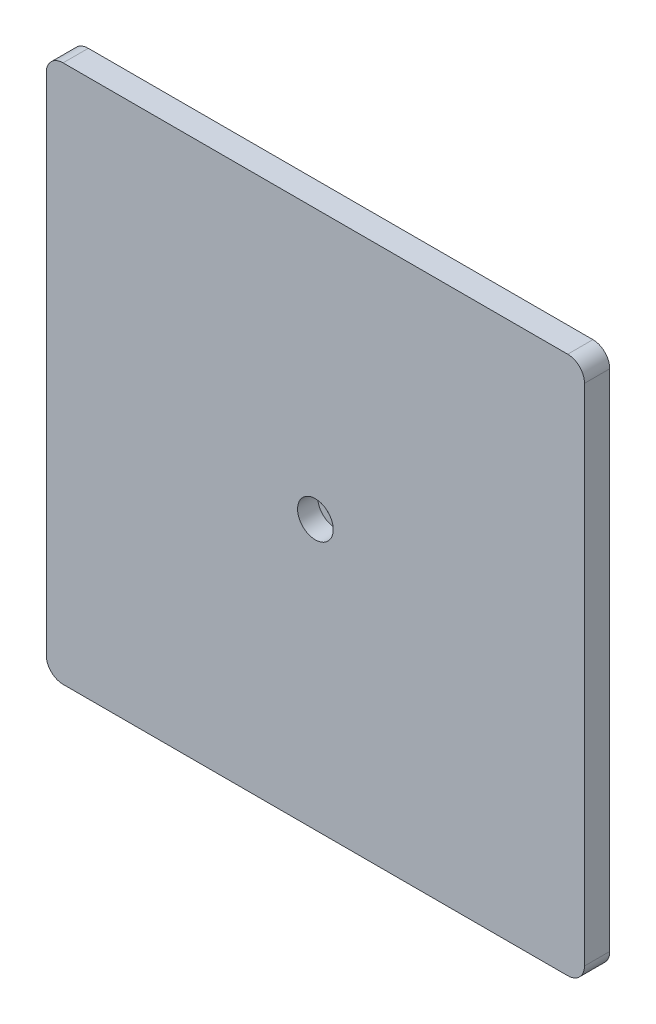
ISO-10303-21;
HEADER;
FILE_DESCRIPTION(('STEP AP214'),'2;1');
FILE_NAME('part.step','',(''),(''),'','','');
FILE_SCHEMA(('AUTOMOTIVE_DESIGN { 1 0 10303 214 1 1 1 1 }'));
ENDSEC;
DATA;
#1=APPLICATION_CONTEXT('core data for automotive mechanical design processes');
#2=APPLICATION_PROTOCOL_DEFINITION('international standard','automotive_design',2000,#1);
#3=PRODUCT_CONTEXT('',#1,'mechanical');
#4=PRODUCT('Part','Part','',(#3));
#5=PRODUCT_RELATED_PRODUCT_CATEGORY('part','',(#4));
#6=PRODUCT_DEFINITION_FORMATION('','',#4);
#7=PRODUCT_DEFINITION_CONTEXT('part definition',#1,'design');
#8=PRODUCT_DEFINITION('design','',#6,#7);
#9=PRODUCT_DEFINITION_SHAPE('','',#8);
#10=(LENGTH_UNIT() NAMED_UNIT(*) SI_UNIT(.MILLI.,.METRE.));
#11=(NAMED_UNIT(*) PLANE_ANGLE_UNIT() SI_UNIT($,.RADIAN.));
#12=(NAMED_UNIT(*) SI_UNIT($,.STERADIAN.) SOLID_ANGLE_UNIT());
#13=UNCERTAINTY_MEASURE_WITH_UNIT(LENGTH_MEASURE(1.E-05),#10,'distance_accuracy_value','');
#14=(GEOMETRIC_REPRESENTATION_CONTEXT(3) GLOBAL_UNCERTAINTY_ASSIGNED_CONTEXT((#13)) GLOBAL_UNIT_ASSIGNED_CONTEXT((#10,
#11,#12)) REPRESENTATION_CONTEXT('',''));
#15=CARTESIAN_POINT('',(0.,0.,0.));
#16=DIRECTION('',(0.,0.,1.));
#17=DIRECTION('',(1.,0.,0.));
#18=AXIS2_PLACEMENT_3D('',#15,#16,#17);
#19=CARTESIAN_POINT('',(-150.,-150.,15.));
#20=DIRECTION('',(0.,0.,-1.));
#21=DIRECTION('',(-1.,0.,0.));
#22=AXIS2_PLACEMENT_3D('',#19,#20,#21);
#23=CYLINDRICAL_SURFACE('',#22,10.);
#24=CARTESIAN_POINT('',(-150.,-150.,0.));
#25=DIRECTION('',(0.,0.,1.));
#26=DIRECTION('',(1.,0.,0.));
#27=AXIS2_PLACEMENT_3D('',#24,#25,#26);
#28=CIRCLE('',#27,10.);
#29=CARTESIAN_POINT('',(-160.,-150.,0.));
#30=VERTEX_POINT('',#29);
#31=CARTESIAN_POINT('',(-150.,-160.,0.));
#32=VERTEX_POINT('',#31);
#33=EDGE_CURVE('E140',#30,#32,#28,.T.);
#34=ORIENTED_EDGE('',*,*,#33,.T.);
#35=DIRECTION('',(0.,0.,-1.));
#36=VECTOR('',#35,1.);
#37=CARTESIAN_POINT('',(-150.,-160.,15.));
#38=LINE('',#37,#36);
#39=CARTESIAN_POINT('',(-150.,-160.,15.));
#40=VERTEX_POINT('',#39);
#41=EDGE_CURVE('E11',#40,#32,#38,.T.);
#42=ORIENTED_EDGE('',*,*,#41,.F.);
#43=CARTESIAN_POINT('',(-150.,-150.,15.));
#44=DIRECTION('',(0.,0.,1.));
#45=DIRECTION('',(1.,0.,0.));
#46=AXIS2_PLACEMENT_3D('',#43,#44,#45);
#47=CIRCLE('',#46,10.);
#48=CARTESIAN_POINT('',(-160.,-150.,15.));
#49=VERTEX_POINT('',#48);
#50=EDGE_CURVE('E163',#49,#40,#47,.T.);
#51=ORIENTED_EDGE('',*,*,#50,.F.);
#52=DIRECTION('',(0.,0.,-1.));
#53=VECTOR('',#52,1.);
#54=CARTESIAN_POINT('',(-160.,-150.,15.));
#55=LINE('',#54,#53);
#56=EDGE_CURVE('E136',#49,#30,#55,.T.);
#57=ORIENTED_EDGE('',*,*,#56,.T.);
#58=EDGE_LOOP('',(#34,#42,#51,#57));
#59=FACE_BOUND('',#58,.T.);
#60=ADVANCED_FACE('F38',(#59),#23,.T.);
#61=CARTESIAN_POINT('',(-150.,-160.,15.));
#62=DIRECTION('',(0.,1.,0.));
#63=DIRECTION('',(0.,0.,1.));
#64=AXIS2_PLACEMENT_3D('',#61,#62,#63);
#65=PLANE('',#64);
#66=DIRECTION('',(1.,0.,0.));
#67=VECTOR('',#66,1.);
#68=CARTESIAN_POINT('',(-150.,-160.,0.));
#69=LINE('',#68,#67);
#70=CARTESIAN_POINT('',(150.,-160.,0.));
#71=VERTEX_POINT('',#70);
#72=EDGE_CURVE('E144',#32,#71,#69,.T.);
#73=ORIENTED_EDGE('',*,*,#72,.T.);
#74=DIRECTION('',(0.,0.,-1.));
#75=VECTOR('',#74,1.);
#76=CARTESIAN_POINT('',(150.,-160.,15.));
#77=LINE('',#76,#75);
#78=CARTESIAN_POINT('',(150.,-160.,15.));
#79=VERTEX_POINT('',#78);
#80=EDGE_CURVE('E48',#79,#71,#77,.T.);
#81=ORIENTED_EDGE('',*,*,#80,.F.);
#82=DIRECTION('',(1.,0.,0.));
#83=VECTOR('',#82,1.);
#84=CARTESIAN_POINT('',(-150.,-160.,15.));
#85=LINE('',#84,#83);
#86=EDGE_CURVE('E99',#40,#79,#85,.T.);
#87=ORIENTED_EDGE('',*,*,#86,.F.);
#88=ORIENTED_EDGE('',*,*,#41,.T.);
#89=EDGE_LOOP('',(#73,#81,#87,#88));
#90=FACE_BOUND('',#89,.T.);
#91=ADVANCED_FACE('F236',(#90),#65,.F.);
#92=CARTESIAN_POINT('',(150.,-150.,15.));
#93=DIRECTION('',(0.,0.,-1.));
#94=DIRECTION('',(-1.,0.,0.));
#95=AXIS2_PLACEMENT_3D('',#92,#93,#94);
#96=CYLINDRICAL_SURFACE('',#95,10.);
#97=CARTESIAN_POINT('',(150.,-150.,0.));
#98=DIRECTION('',(0.,0.,1.));
#99=DIRECTION('',(1.,0.,0.));
#100=AXIS2_PLACEMENT_3D('',#97,#98,#99);
#101=CIRCLE('',#100,10.);
#102=CARTESIAN_POINT('',(160.,-150.,0.));
#103=VERTEX_POINT('',#102);
#104=EDGE_CURVE('E148',#71,#103,#101,.T.);
#105=ORIENTED_EDGE('',*,*,#104,.T.);
#106=DIRECTION('',(0.,0.,-1.));
#107=VECTOR('',#106,1.);
#108=CARTESIAN_POINT('',(160.,-150.,15.));
#109=LINE('',#108,#107);
#110=CARTESIAN_POINT('',(160.,-150.,15.));
#111=VERTEX_POINT('',#110);
#112=EDGE_CURVE('E174',#111,#103,#109,.T.);
#113=ORIENTED_EDGE('',*,*,#112,.F.);
#114=CARTESIAN_POINT('',(150.,-150.,15.));
#115=DIRECTION('',(0.,0.,1.));
#116=DIRECTION('',(1.,0.,0.));
#117=AXIS2_PLACEMENT_3D('',#114,#115,#116);
#118=CIRCLE('',#117,10.);
#119=EDGE_CURVE('E185',#79,#111,#118,.T.);
#120=ORIENTED_EDGE('',*,*,#119,.F.);
#121=ORIENTED_EDGE('',*,*,#80,.T.);
#122=EDGE_LOOP('',(#105,#113,#120,#121));
#123=FACE_BOUND('',#122,.T.);
#124=ADVANCED_FACE('F183',(#123),#96,.T.);
#125=CARTESIAN_POINT('',(160.,150.,15.));
#126=DIRECTION('',(-1.,0.,0.));
#127=DIRECTION('',(0.,-1.,0.));
#128=AXIS2_PLACEMENT_3D('',#125,#126,#127);
#129=PLANE('',#128);
#130=DIRECTION('',(0.,1.,0.));
#131=VECTOR('',#130,1.);
#132=CARTESIAN_POINT('',(160.,150.,0.));
#133=LINE('',#132,#131);
#134=CARTESIAN_POINT('',(160.,150.,0.));
#135=VERTEX_POINT('',#134);
#136=EDGE_CURVE('E151',#103,#135,#133,.T.);
#137=ORIENTED_EDGE('',*,*,#136,.T.);
#138=DIRECTION('',(0.,0.,-1.));
#139=VECTOR('',#138,1.);
#140=CARTESIAN_POINT('',(160.,150.,15.));
#141=LINE('',#140,#139);
#142=CARTESIAN_POINT('',(160.,150.,15.));
#143=VERTEX_POINT('',#142);
#144=EDGE_CURVE('E170',#143,#135,#141,.T.);
#145=ORIENTED_EDGE('',*,*,#144,.F.);
#146=DIRECTION('',(0.,1.,0.));
#147=VECTOR('',#146,1.);
#148=CARTESIAN_POINT('',(160.,150.,15.));
#149=LINE('',#148,#147);
#150=EDGE_CURVE('E198',#111,#143,#149,.T.);
#151=ORIENTED_EDGE('',*,*,#150,.F.);
#152=ORIENTED_EDGE('',*,*,#112,.T.);
#153=EDGE_LOOP('',(#137,#145,#151,#152));
#154=FACE_BOUND('',#153,.T.);
#155=ADVANCED_FACE('F193',(#154),#129,.F.);
#156=CARTESIAN_POINT('',(150.,150.,15.));
#157=DIRECTION('',(0.,0.,-1.));
#158=DIRECTION('',(-1.,0.,0.));
#159=AXIS2_PLACEMENT_3D('',#156,#157,#158);
#160=CYLINDRICAL_SURFACE('',#159,10.);
#161=CARTESIAN_POINT('',(150.,150.,0.));
#162=DIRECTION('',(0.,0.,1.));
#163=DIRECTION('',(-1.,0.,0.));
#164=AXIS2_PLACEMENT_3D('',#161,#162,#163);
#165=CIRCLE('',#164,10.);
#166=CARTESIAN_POINT('',(150.,160.,0.));
#167=VERTEX_POINT('',#166);
#168=EDGE_CURVE('E154',#135,#167,#165,.T.);
#169=ORIENTED_EDGE('',*,*,#168,.T.);
#170=DIRECTION('',(0.,0.,-1.));
#171=VECTOR('',#170,1.);
#172=CARTESIAN_POINT('',(150.,160.,15.));
#173=LINE('',#172,#171);
#174=CARTESIAN_POINT('',(150.,160.,15.));
#175=VERTEX_POINT('',#174);
#176=EDGE_CURVE('E129',#175,#167,#173,.T.);
#177=ORIENTED_EDGE('',*,*,#176,.F.);
#178=CARTESIAN_POINT('',(150.,150.,15.));
#179=DIRECTION('',(0.,0.,1.));
#180=DIRECTION('',(-1.,0.,0.));
#181=AXIS2_PLACEMENT_3D('',#178,#179,#180);
#182=CIRCLE('',#181,10.);
#183=EDGE_CURVE('E118',#143,#175,#182,.T.);
#184=ORIENTED_EDGE('',*,*,#183,.F.);
#185=ORIENTED_EDGE('',*,*,#144,.T.);
#186=EDGE_LOOP('',(#169,#177,#184,#185));
#187=FACE_BOUND('',#186,.T.);
#188=ADVANCED_FACE('F196',(#187),#160,.T.);
#189=CARTESIAN_POINT('',(-150.,160.,15.));
#190=DIRECTION('',(0.,-1.,0.));
#191=DIRECTION('',(0.,0.,-1.));
#192=AXIS2_PLACEMENT_3D('',#189,#190,#191);
#193=PLANE('',#192);
#194=DIRECTION('',(-1.,0.,0.));
#195=VECTOR('',#194,1.);
#196=CARTESIAN_POINT('',(-150.,160.,0.));
#197=LINE('',#196,#195);
#198=CARTESIAN_POINT('',(-150.,160.,0.));
#199=VERTEX_POINT('',#198);
#200=EDGE_CURVE('E127',#167,#199,#197,.T.);
#201=ORIENTED_EDGE('',*,*,#200,.T.);
#202=DIRECTION('',(0.,0.,-1.));
#203=VECTOR('',#202,1.);
#204=CARTESIAN_POINT('',(-150.,160.,15.));
#205=LINE('',#204,#203);
#206=CARTESIAN_POINT('',(-150.,160.,15.));
#207=VERTEX_POINT('',#206);
#208=EDGE_CURVE('E124',#207,#199,#205,.T.);
#209=ORIENTED_EDGE('',*,*,#208,.F.);
#210=DIRECTION('',(-1.,0.,0.));
#211=VECTOR('',#210,1.);
#212=CARTESIAN_POINT('',(-150.,160.,15.));
#213=LINE('',#212,#211);
#214=EDGE_CURVE('E112',#175,#207,#213,.T.);
#215=ORIENTED_EDGE('',*,*,#214,.F.);
#216=ORIENTED_EDGE('',*,*,#176,.T.);
#217=EDGE_LOOP('',(#201,#209,#215,#216));
#218=FACE_BOUND('',#217,.T.);
#219=ADVANCED_FACE('F125',(#218),#193,.F.);
#220=CARTESIAN_POINT('',(-150.,150.,15.));
#221=DIRECTION('',(0.,0.,-1.));
#222=DIRECTION('',(-1.,0.,0.));
#223=AXIS2_PLACEMENT_3D('',#220,#221,#222);
#224=CYLINDRICAL_SURFACE('',#223,10.);
#225=CARTESIAN_POINT('',(-150.,150.,0.));
#226=DIRECTION('',(0.,0.,1.));
#227=DIRECTION('',(1.,0.,0.));
#228=AXIS2_PLACEMENT_3D('',#225,#226,#227);
#229=CIRCLE('',#228,10.);
#230=CARTESIAN_POINT('',(-160.,150.,0.));
#231=VERTEX_POINT('',#230);
#232=EDGE_CURVE('E85',#199,#231,#229,.T.);
#233=ORIENTED_EDGE('',*,*,#232,.T.);
#234=DIRECTION('',(0.,0.,-1.));
#235=VECTOR('',#234,1.);
#236=CARTESIAN_POINT('',(-160.,150.,15.));
#237=LINE('',#236,#235);
#238=CARTESIAN_POINT('',(-160.,150.,15.));
#239=VERTEX_POINT('',#238);
#240=EDGE_CURVE('E130',#239,#231,#237,.T.);
#241=ORIENTED_EDGE('',*,*,#240,.F.);
#242=CARTESIAN_POINT('',(-150.,150.,15.));
#243=DIRECTION('',(0.,0.,1.));
#244=DIRECTION('',(1.,0.,0.));
#245=AXIS2_PLACEMENT_3D('',#242,#243,#244);
#246=CIRCLE('',#245,10.);
#247=EDGE_CURVE('E116',#207,#239,#246,.T.);
#248=ORIENTED_EDGE('',*,*,#247,.F.);
#249=ORIENTED_EDGE('',*,*,#208,.T.);
#250=EDGE_LOOP('',(#233,#241,#248,#249));
#251=FACE_BOUND('',#250,.T.);
#252=ADVANCED_FACE('F132',(#251),#224,.T.);
#253=CARTESIAN_POINT('',(-160.,150.,15.));
#254=DIRECTION('',(1.,0.,0.));
#255=DIRECTION('',(0.,1.,0.));
#256=AXIS2_PLACEMENT_3D('',#253,#254,#255);
#257=PLANE('',#256);
#258=DIRECTION('',(0.,-1.,0.));
#259=VECTOR('',#258,1.);
#260=CARTESIAN_POINT('',(-160.,150.,0.));
#261=LINE('',#260,#259);
#262=EDGE_CURVE('E91',#231,#30,#261,.T.);
#263=ORIENTED_EDGE('',*,*,#262,.T.);
#264=ORIENTED_EDGE('',*,*,#56,.F.);
#265=DIRECTION('',(0.,-1.,0.));
#266=VECTOR('',#265,1.);
#267=CARTESIAN_POINT('',(-160.,150.,15.));
#268=LINE('',#267,#266);
#269=EDGE_CURVE('E56',#239,#49,#268,.T.);
#270=ORIENTED_EDGE('',*,*,#269,.F.);
#271=ORIENTED_EDGE('',*,*,#240,.T.);
#272=EDGE_LOOP('',(#263,#264,#270,#271));
#273=FACE_BOUND('',#272,.T.);
#274=ADVANCED_FACE('F243',(#273),#257,.F.);
#275=CARTESIAN_POINT('',(-150.,-150.,15.));
#276=DIRECTION('',(0.,0.,1.));
#277=DIRECTION('',(1.,0.,0.));
#278=AXIS2_PLACEMENT_3D('',#275,#276,#277);
#279=PLANE('',#278);
#280=CARTESIAN_POINT('',(0.,0.,15.));
#281=DIRECTION('',(0.,0.,1.));
#282=DIRECTION('',(1.,0.,0.));
#283=AXIS2_PLACEMENT_3D('',#280,#281,#282);
#284=CIRCLE('',#283,10.6);
#285=CARTESIAN_POINT('',(10.6,0.,15.));
#286=VERTEX_POINT('',#285);
#287=EDGE_CURVE('E208',#286,#286,#284,.T.);
#288=ORIENTED_EDGE('',*,*,#287,.F.);
#289=EDGE_LOOP('',(#288));
#290=FACE_BOUND('',#289,.T.);
#291=ORIENTED_EDGE('',*,*,#50,.T.);
#292=ORIENTED_EDGE('',*,*,#86,.T.);
#293=ORIENTED_EDGE('',*,*,#119,.T.);
#294=ORIENTED_EDGE('',*,*,#150,.T.);
#295=ORIENTED_EDGE('',*,*,#183,.T.);
#296=ORIENTED_EDGE('',*,*,#214,.T.);
#297=ORIENTED_EDGE('',*,*,#247,.T.);
#298=ORIENTED_EDGE('',*,*,#269,.T.);
#299=EDGE_LOOP('',(#291,#292,#293,#294,#295,#296,#297,#298));
#300=FACE_BOUND('',#299,.T.);
#301=ADVANCED_FACE('F114',(#290,#300),#279,.T.);
#302=CARTESIAN_POINT('',(-150.,-150.,0.));
#303=DIRECTION('',(0.,0.,1.));
#304=DIRECTION('',(1.,0.,0.));
#305=AXIS2_PLACEMENT_3D('',#302,#303,#304);
#306=PLANE('',#305);
#307=CARTESIAN_POINT('',(0.,0.,0.));
#308=DIRECTION('',(0.,0.,1.));
#309=DIRECTION('',(1.,0.,0.));
#310=AXIS2_PLACEMENT_3D('',#307,#308,#309);
#311=CIRCLE('',#310,6.5);
#312=CARTESIAN_POINT('',(6.5,0.,0.));
#313=VERTEX_POINT('',#312);
#314=EDGE_CURVE('E41',#313,#313,#311,.T.);
#315=ORIENTED_EDGE('',*,*,#314,.T.);
#316=EDGE_LOOP('',(#315));
#317=FACE_BOUND('',#316,.T.);
#318=ORIENTED_EDGE('',*,*,#33,.F.);
#319=ORIENTED_EDGE('',*,*,#262,.F.);
#320=ORIENTED_EDGE('',*,*,#232,.F.);
#321=ORIENTED_EDGE('',*,*,#200,.F.);
#322=ORIENTED_EDGE('',*,*,#168,.F.);
#323=ORIENTED_EDGE('',*,*,#136,.F.);
#324=ORIENTED_EDGE('',*,*,#104,.F.);
#325=ORIENTED_EDGE('',*,*,#72,.F.);
#326=EDGE_LOOP('',(#318,#319,#320,#321,#322,#323,#324,#325));
#327=FACE_BOUND('',#326,.T.);
#328=ADVANCED_FACE('F189',(#317,#327),#306,.F.);
#329=CARTESIAN_POINT('',(0.,0.,3.));
#330=DIRECTION('',(0.,0.,1.));
#331=DIRECTION('',(1.,0.,0.));
#332=AXIS2_PLACEMENT_3D('',#329,#330,#331);
#333=CYLINDRICAL_SURFACE('',#332,10.6);
#334=CARTESIAN_POINT('',(0.,0.,3.));
#335=DIRECTION('',(0.,0.,1.));
#336=DIRECTION('',(1.,0.,0.));
#337=AXIS2_PLACEMENT_3D('',#334,#335,#336);
#338=CIRCLE('',#337,10.6);
#339=CARTESIAN_POINT('',(10.6,0.,3.));
#340=VERTEX_POINT('',#339);
#341=EDGE_CURVE('E145',#340,#340,#338,.T.);
#342=ORIENTED_EDGE('',*,*,#341,.F.);
#343=EDGE_LOOP('',(#342));
#344=FACE_BOUND('',#343,.T.);
#345=ORIENTED_EDGE('',*,*,#287,.T.);
#346=EDGE_LOOP('',(#345));
#347=FACE_BOUND('',#346,.T.);
#348=ADVANCED_FACE('F232',(#344,#347),#333,.F.);
#349=CARTESIAN_POINT('',(0.,0.,3.));
#350=DIRECTION('',(0.,0.,1.));
#351=DIRECTION('',(1.,0.,0.));
#352=AXIS2_PLACEMENT_3D('',#349,#350,#351);
#353=PLANE('',#352);
#354=CARTESIAN_POINT('',(0.,0.,3.));
#355=DIRECTION('',(0.,0.,1.));
#356=DIRECTION('',(1.,0.,0.));
#357=AXIS2_PLACEMENT_3D('',#354,#355,#356);
#358=CIRCLE('',#357,6.5);
#359=CARTESIAN_POINT('',(6.5,0.,3.));
#360=VERTEX_POINT('',#359);
#361=EDGE_CURVE('E215',#360,#360,#358,.T.);
#362=ORIENTED_EDGE('',*,*,#361,.F.);
#363=EDGE_LOOP('',(#362));
#364=FACE_BOUND('',#363,.T.);
#365=ORIENTED_EDGE('',*,*,#341,.T.);
#366=EDGE_LOOP('',(#365));
#367=FACE_BOUND('',#366,.T.);
#368=ADVANCED_FACE('F227',(#364,#367),#353,.T.);
#369=CARTESIAN_POINT('',(0.,0.,-7.));
#370=DIRECTION('',(0.,0.,1.));
#371=DIRECTION('',(1.,0.,0.));
#372=AXIS2_PLACEMENT_3D('',#369,#370,#371);
#373=CYLINDRICAL_SURFACE('',#372,6.5);
#374=ORIENTED_EDGE('',*,*,#361,.T.);
#375=EDGE_LOOP('',(#374));
#376=FACE_BOUND('',#375,.T.);
#377=ORIENTED_EDGE('',*,*,#314,.F.);
#378=EDGE_LOOP('',(#377));
#379=FACE_BOUND('',#378,.T.);
#380=ADVANCED_FACE('F225',(#376,#379),#373,.F.);
#381=CLOSED_SHELL('',(#60,#91,#124,#155,#188,#219,#252,#274,#301,#328,#348,#368,#380));
#382=MANIFOLD_SOLID_BREP('B2',#381);
#383=ADVANCED_BREP_SHAPE_REPRESENTATION('',(#18,#382),#14);
#384=SHAPE_DEFINITION_REPRESENTATION(#9,#383);
ENDSEC;
END-ISO-10303-21;
